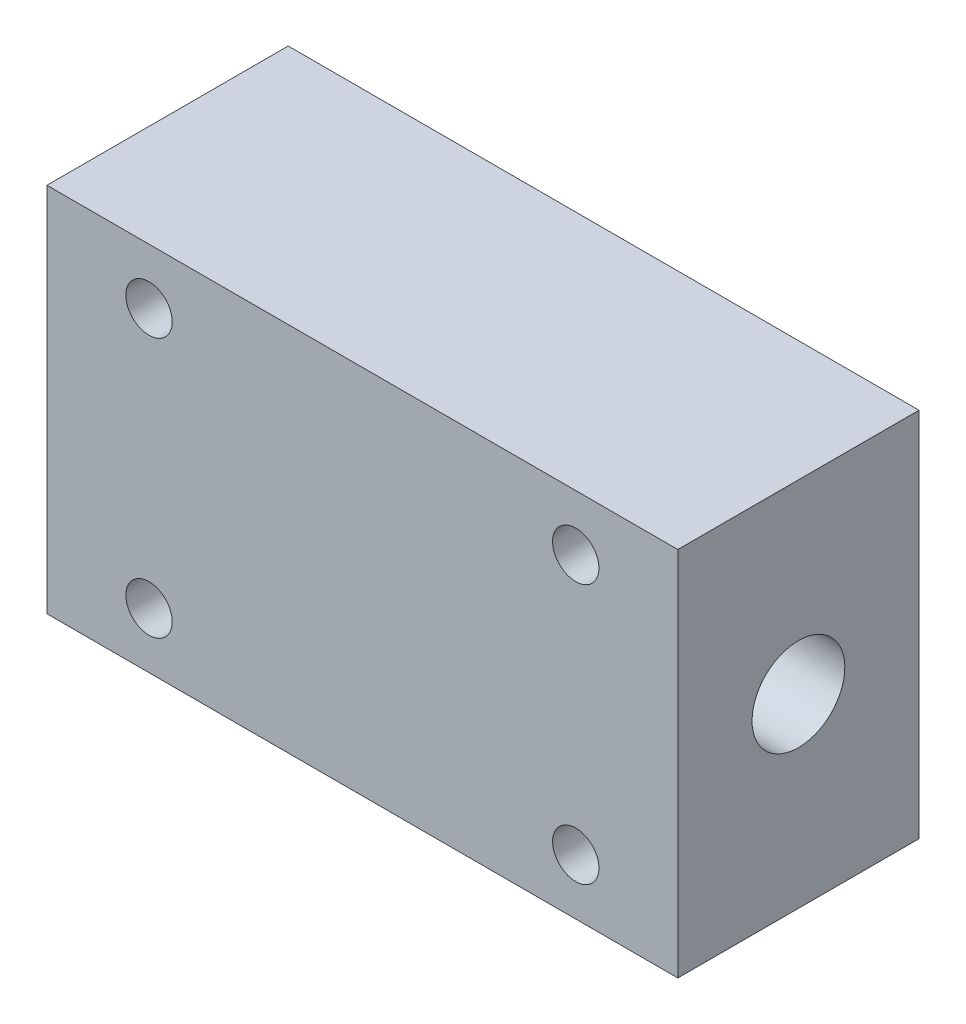
ISO-10303-21;
HEADER;
FILE_DESCRIPTION(('STEP AP214'),'2;1');
FILE_NAME('part.step','',(''),(''),'','','');
FILE_SCHEMA(('AUTOMOTIVE_DESIGN { 1 0 10303 214 1 1 1 1 }'));
ENDSEC;
DATA;
#1=APPLICATION_CONTEXT('core data for automotive mechanical design processes');
#2=APPLICATION_PROTOCOL_DEFINITION('international standard','automotive_design',2000,#1);
#3=PRODUCT_CONTEXT('',#1,'mechanical');
#4=PRODUCT('Part','Part','',(#3));
#5=PRODUCT_RELATED_PRODUCT_CATEGORY('part','',(#4));
#6=PRODUCT_DEFINITION_FORMATION('','',#4);
#7=PRODUCT_DEFINITION_CONTEXT('part definition',#1,'design');
#8=PRODUCT_DEFINITION('design','',#6,#7);
#9=PRODUCT_DEFINITION_SHAPE('','',#8);
#10=(LENGTH_UNIT() NAMED_UNIT(*) SI_UNIT(.MILLI.,.METRE.));
#11=(NAMED_UNIT(*) PLANE_ANGLE_UNIT() SI_UNIT($,.RADIAN.));
#12=(NAMED_UNIT(*) SI_UNIT($,.STERADIAN.) SOLID_ANGLE_UNIT());
#13=UNCERTAINTY_MEASURE_WITH_UNIT(LENGTH_MEASURE(1.E-05),#10,'distance_accuracy_value','');
#14=(GEOMETRIC_REPRESENTATION_CONTEXT(3) GLOBAL_UNCERTAINTY_ASSIGNED_CONTEXT((#13)) GLOBAL_UNIT_ASSIGNED_CONTEXT((#10,
#11,#12)) REPRESENTATION_CONTEXT('',''));
#15=CARTESIAN_POINT('',(0.,0.,0.));
#16=DIRECTION('',(0.,0.,1.));
#17=DIRECTION('',(1.,0.,0.));
#18=AXIS2_PLACEMENT_3D('',#15,#16,#17);
#19=CARTESIAN_POINT('',(0.,0.,-26.));
#20=DIRECTION('',(-1.,0.,0.));
#21=DIRECTION('',(0.,-1.,0.));
#22=AXIS2_PLACEMENT_3D('',#19,#20,#21);
#23=PLANE('',#22);
#24=CARTESIAN_POINT('',(0.,20.,-13.));
#25=DIRECTION('',(-1.,0.,0.));
#26=DIRECTION('',(0.,-1.,0.));
#27=AXIS2_PLACEMENT_3D('',#24,#25,#26);
#28=CIRCLE('',#27,5.);
#29=CARTESIAN_POINT('',(0.,15.,-13.));
#30=VERTEX_POINT('',#29);
#31=EDGE_CURVE('E179',#30,#30,#28,.T.);
#32=ORIENTED_EDGE('',*,*,#31,.F.);
#33=EDGE_LOOP('',(#32));
#34=FACE_BOUND('',#33,.T.);
#35=DIRECTION('',(0.,-1.,0.));
#36=VECTOR('',#35,1.);
#37=CARTESIAN_POINT('',(0.,0.,0.));
#38=LINE('',#37,#36);
#39=CARTESIAN_POINT('',(0.,40.,0.));
#40=VERTEX_POINT('',#39);
#41=CARTESIAN_POINT('',(0.,0.,0.));
#42=VERTEX_POINT('',#41);
#43=EDGE_CURVE('E98',#40,#42,#38,.T.);
#44=ORIENTED_EDGE('',*,*,#43,.F.);
#45=DIRECTION('',(0.,0.,1.));
#46=VECTOR('',#45,1.);
#47=CARTESIAN_POINT('',(0.,40.,-26.));
#48=LINE('',#47,#46);
#49=CARTESIAN_POINT('',(0.,40.,-26.));
#50=VERTEX_POINT('',#49);
#51=EDGE_CURVE('E11',#50,#40,#48,.T.);
#52=ORIENTED_EDGE('',*,*,#51,.F.);
#53=DIRECTION('',(0.,-1.,0.));
#54=VECTOR('',#53,1.);
#55=CARTESIAN_POINT('',(0.,0.,-26.));
#56=LINE('',#55,#54);
#57=CARTESIAN_POINT('',(0.,0.,-26.));
#58=VERTEX_POINT('',#57);
#59=EDGE_CURVE('E91',#50,#58,#56,.T.);
#60=ORIENTED_EDGE('',*,*,#59,.T.);
#61=DIRECTION('',(0.,0.,1.));
#62=VECTOR('',#61,1.);
#63=CARTESIAN_POINT('',(0.,0.,-26.));
#64=LINE('',#63,#62);
#65=EDGE_CURVE('E36',#58,#42,#64,.T.);
#66=ORIENTED_EDGE('',*,*,#65,.T.);
#67=EDGE_LOOP('',(#44,#52,#60,#66));
#68=FACE_BOUND('',#67,.T.);
#69=ADVANCED_FACE('F33',(#34,#68),#23,.T.);
#70=CARTESIAN_POINT('',(0.,40.,-26.));
#71=DIRECTION('',(0.,1.,0.));
#72=DIRECTION('',(0.,0.,1.));
#73=AXIS2_PLACEMENT_3D('',#70,#71,#72);
#74=PLANE('',#73);
#75=DIRECTION('',(-1.,0.,0.));
#76=VECTOR('',#75,1.);
#77=CARTESIAN_POINT('',(0.,40.,0.));
#78=LINE('',#77,#76);
#79=CARTESIAN_POINT('',(68.,40.,0.));
#80=VERTEX_POINT('',#79);
#81=EDGE_CURVE('E93',#80,#40,#78,.T.);
#82=ORIENTED_EDGE('',*,*,#81,.F.);
#83=DIRECTION('',(0.,0.,1.));
#84=VECTOR('',#83,1.);
#85=CARTESIAN_POINT('',(68.,40.,-26.));
#86=LINE('',#85,#84);
#87=CARTESIAN_POINT('',(68.,40.,-26.));
#88=VERTEX_POINT('',#87);
#89=EDGE_CURVE('E42',#88,#80,#86,.T.);
#90=ORIENTED_EDGE('',*,*,#89,.F.);
#91=DIRECTION('',(-1.,0.,0.));
#92=VECTOR('',#91,1.);
#93=CARTESIAN_POINT('',(0.,40.,-26.));
#94=LINE('',#93,#92);
#95=EDGE_CURVE('E88',#88,#50,#94,.T.);
#96=ORIENTED_EDGE('',*,*,#95,.T.);
#97=ORIENTED_EDGE('',*,*,#51,.T.);
#98=EDGE_LOOP('',(#82,#90,#96,#97));
#99=FACE_BOUND('',#98,.T.);
#100=ADVANCED_FACE('F109',(#99),#74,.T.);
#101=CARTESIAN_POINT('',(68.,0.,-26.));
#102=DIRECTION('',(1.,0.,0.));
#103=DIRECTION('',(0.,1.,0.));
#104=AXIS2_PLACEMENT_3D('',#101,#102,#103);
#105=PLANE('',#104);
#106=CARTESIAN_POINT('',(68.,20.,-13.));
#107=DIRECTION('',(-1.,0.,0.));
#108=DIRECTION('',(0.,-1.,0.));
#109=AXIS2_PLACEMENT_3D('',#106,#107,#108);
#110=CIRCLE('',#109,5.);
#111=CARTESIAN_POINT('',(68.,15.,-13.));
#112=VERTEX_POINT('',#111);
#113=EDGE_CURVE('E102',#112,#112,#110,.T.);
#114=ORIENTED_EDGE('',*,*,#113,.T.);
#115=EDGE_LOOP('',(#114));
#116=FACE_BOUND('',#115,.T.);
#117=DIRECTION('',(0.,1.,0.));
#118=VECTOR('',#117,1.);
#119=CARTESIAN_POINT('',(68.,0.,0.));
#120=LINE('',#119,#118);
#121=CARTESIAN_POINT('',(68.,0.,0.));
#122=VERTEX_POINT('',#121);
#123=EDGE_CURVE('E83',#122,#80,#120,.T.);
#124=ORIENTED_EDGE('',*,*,#123,.F.);
#125=DIRECTION('',(0.,0.,1.));
#126=VECTOR('',#125,1.);
#127=CARTESIAN_POINT('',(68.,0.,-26.));
#128=LINE('',#127,#126);
#129=CARTESIAN_POINT('',(68.,0.,-26.));
#130=VERTEX_POINT('',#129);
#131=EDGE_CURVE('E78',#130,#122,#128,.T.);
#132=ORIENTED_EDGE('',*,*,#131,.F.);
#133=DIRECTION('',(0.,1.,0.));
#134=VECTOR('',#133,1.);
#135=CARTESIAN_POINT('',(68.,0.,-26.));
#136=LINE('',#135,#134);
#137=EDGE_CURVE('E81',#130,#88,#136,.T.);
#138=ORIENTED_EDGE('',*,*,#137,.T.);
#139=ORIENTED_EDGE('',*,*,#89,.T.);
#140=EDGE_LOOP('',(#124,#132,#138,#139));
#141=FACE_BOUND('',#140,.T.);
#142=ADVANCED_FACE('F80',(#116,#141),#105,.T.);
#143=CARTESIAN_POINT('',(0.,0.,-26.));
#144=DIRECTION('',(0.,-1.,0.));
#145=DIRECTION('',(0.,0.,-1.));
#146=AXIS2_PLACEMENT_3D('',#143,#144,#145);
#147=PLANE('',#146);
#148=DIRECTION('',(1.,0.,0.));
#149=VECTOR('',#148,1.);
#150=CARTESIAN_POINT('',(0.,0.,0.));
#151=LINE('',#150,#149);
#152=EDGE_CURVE('E101',#42,#122,#151,.T.);
#153=ORIENTED_EDGE('',*,*,#152,.F.);
#154=ORIENTED_EDGE('',*,*,#65,.F.);
#155=DIRECTION('',(1.,0.,0.));
#156=VECTOR('',#155,1.);
#157=CARTESIAN_POINT('',(0.,0.,-26.));
#158=LINE('',#157,#156);
#159=EDGE_CURVE('E87',#58,#130,#158,.T.);
#160=ORIENTED_EDGE('',*,*,#159,.T.);
#161=ORIENTED_EDGE('',*,*,#131,.T.);
#162=EDGE_LOOP('',(#153,#154,#160,#161));
#163=FACE_BOUND('',#162,.T.);
#164=ADVANCED_FACE('F90',(#163),#147,.T.);
#165=CARTESIAN_POINT('',(0.,0.,-26.));
#166=DIRECTION('',(0.,0.,-1.));
#167=DIRECTION('',(-1.,0.,0.));
#168=AXIS2_PLACEMENT_3D('',#165,#166,#167);
#169=PLANE('',#168);
#170=CARTESIAN_POINT('',(11.,6.,-26.));
#171=DIRECTION('',(0.,0.,-1.));
#172=DIRECTION('',(1.,0.,0.));
#173=AXIS2_PLACEMENT_3D('',#170,#171,#172);
#174=CIRCLE('',#173,2.5);
#175=CARTESIAN_POINT('',(8.50000000000001,6.,-26.));
#176=VERTEX_POINT('',#175);
#177=EDGE_CURVE('E159',#176,#176,#174,.T.);
#178=ORIENTED_EDGE('',*,*,#177,.F.);
#179=EDGE_LOOP('',(#178));
#180=FACE_BOUND('',#179,.T.);
#181=CARTESIAN_POINT('',(57.,5.99999999999998,-26.));
#182=DIRECTION('',(0.,0.,-1.));
#183=DIRECTION('',(-1.,0.,0.));
#184=AXIS2_PLACEMENT_3D('',#181,#182,#183);
#185=CIRCLE('',#184,2.5);
#186=CARTESIAN_POINT('',(54.5,5.99999999999998,-26.));
#187=VERTEX_POINT('',#186);
#188=EDGE_CURVE('E161',#187,#187,#185,.T.);
#189=ORIENTED_EDGE('',*,*,#188,.F.);
#190=EDGE_LOOP('',(#189));
#191=FACE_BOUND('',#190,.T.);
#192=CARTESIAN_POINT('',(57.,34.,-26.));
#193=DIRECTION('',(0.,0.,-1.));
#194=DIRECTION('',(1.,0.,0.));
#195=AXIS2_PLACEMENT_3D('',#192,#193,#194);
#196=CIRCLE('',#195,2.5);
#197=CARTESIAN_POINT('',(54.5,34.,-26.));
#198=VERTEX_POINT('',#197);
#199=EDGE_CURVE('E167',#198,#198,#196,.T.);
#200=ORIENTED_EDGE('',*,*,#199,.F.);
#201=EDGE_LOOP('',(#200));
#202=FACE_BOUND('',#201,.T.);
#203=CARTESIAN_POINT('',(11.,34.,-26.));
#204=DIRECTION('',(0.,0.,-1.));
#205=DIRECTION('',(-1.,0.,0.));
#206=AXIS2_PLACEMENT_3D('',#203,#204,#205);
#207=CIRCLE('',#206,2.5);
#208=CARTESIAN_POINT('',(8.50000000000001,34.,-26.));
#209=VERTEX_POINT('',#208);
#210=EDGE_CURVE('E173',#209,#209,#207,.T.);
#211=ORIENTED_EDGE('',*,*,#210,.F.);
#212=EDGE_LOOP('',(#211));
#213=FACE_BOUND('',#212,.T.);
#214=ORIENTED_EDGE('',*,*,#59,.F.);
#215=ORIENTED_EDGE('',*,*,#95,.F.);
#216=ORIENTED_EDGE('',*,*,#137,.F.);
#217=ORIENTED_EDGE('',*,*,#159,.F.);
#218=EDGE_LOOP('',(#214,#215,#216,#217));
#219=FACE_BOUND('',#218,.T.);
#220=ADVANCED_FACE('F86',(#180,#191,#202,#213,#219),#169,.T.);
#221=CARTESIAN_POINT('',(0.,0.,0.));
#222=DIRECTION('',(0.,0.,-1.));
#223=DIRECTION('',(-1.,0.,0.));
#224=AXIS2_PLACEMENT_3D('',#221,#222,#223);
#225=PLANE('',#224);
#226=CARTESIAN_POINT('',(11.,6.,0.));
#227=DIRECTION('',(0.,0.,-1.));
#228=DIRECTION('',(1.,0.,0.));
#229=AXIS2_PLACEMENT_3D('',#226,#227,#228);
#230=CIRCLE('',#229,2.5);
#231=CARTESIAN_POINT('',(8.50000000000001,6.,0.));
#232=VERTEX_POINT('',#231);
#233=EDGE_CURVE('E157',#232,#232,#230,.T.);
#234=ORIENTED_EDGE('',*,*,#233,.T.);
#235=EDGE_LOOP('',(#234));
#236=FACE_BOUND('',#235,.T.);
#237=CARTESIAN_POINT('',(57.,5.99999999999998,0.));
#238=DIRECTION('',(0.,0.,-1.));
#239=DIRECTION('',(-1.,0.,0.));
#240=AXIS2_PLACEMENT_3D('',#237,#238,#239);
#241=CIRCLE('',#240,2.5);
#242=CARTESIAN_POINT('',(54.5,5.99999999999998,0.));
#243=VERTEX_POINT('',#242);
#244=EDGE_CURVE('E164',#243,#243,#241,.T.);
#245=ORIENTED_EDGE('',*,*,#244,.T.);
#246=EDGE_LOOP('',(#245));
#247=FACE_BOUND('',#246,.T.);
#248=CARTESIAN_POINT('',(57.,34.,0.));
#249=DIRECTION('',(0.,0.,-1.));
#250=DIRECTION('',(1.,0.,0.));
#251=AXIS2_PLACEMENT_3D('',#248,#249,#250);
#252=CIRCLE('',#251,2.5);
#253=CARTESIAN_POINT('',(54.5,34.,0.));
#254=VERTEX_POINT('',#253);
#255=EDGE_CURVE('E170',#254,#254,#252,.T.);
#256=ORIENTED_EDGE('',*,*,#255,.T.);
#257=EDGE_LOOP('',(#256));
#258=FACE_BOUND('',#257,.T.);
#259=CARTESIAN_POINT('',(11.,34.,0.));
#260=DIRECTION('',(0.,0.,-1.));
#261=DIRECTION('',(-1.,0.,0.));
#262=AXIS2_PLACEMENT_3D('',#259,#260,#261);
#263=CIRCLE('',#262,2.5);
#264=CARTESIAN_POINT('',(8.50000000000001,34.,0.));
#265=VERTEX_POINT('',#264);
#266=EDGE_CURVE('E176',#265,#265,#263,.T.);
#267=ORIENTED_EDGE('',*,*,#266,.T.);
#268=EDGE_LOOP('',(#267));
#269=FACE_BOUND('',#268,.T.);
#270=ORIENTED_EDGE('',*,*,#43,.T.);
#271=ORIENTED_EDGE('',*,*,#152,.T.);
#272=ORIENTED_EDGE('',*,*,#123,.T.);
#273=ORIENTED_EDGE('',*,*,#81,.T.);
#274=EDGE_LOOP('',(#270,#271,#272,#273));
#275=FACE_BOUND('',#274,.T.);
#276=ADVANCED_FACE('F108',(#236,#247,#258,#269,#275),#225,.F.);
#277=CARTESIAN_POINT('',(68.,20.,-13.));
#278=DIRECTION('',(-1.,0.,0.));
#279=DIRECTION('',(0.,-1.,0.));
#280=AXIS2_PLACEMENT_3D('',#277,#278,#279);
#281=CYLINDRICAL_SURFACE('',#280,5.);
#282=ORIENTED_EDGE('',*,*,#113,.F.);
#283=EDGE_LOOP('',(#282));
#284=FACE_BOUND('',#283,.T.);
#285=ORIENTED_EDGE('',*,*,#31,.T.);
#286=EDGE_LOOP('',(#285));
#287=FACE_BOUND('',#286,.T.);
#288=ADVANCED_FACE('F129',(#284,#287),#281,.F.);
#289=CARTESIAN_POINT('',(11.,34.,0.));
#290=DIRECTION('',(0.,0.,-1.));
#291=DIRECTION('',(-1.,0.,0.));
#292=AXIS2_PLACEMENT_3D('',#289,#290,#291);
#293=CYLINDRICAL_SURFACE('',#292,2.5);
#294=CARTESIAN_POINT('',(8.50000000000001,34.,0.));
#295=CARTESIAN_POINT('',(8.50000000000001,34.,-0.270833333333333));
#296=CARTESIAN_POINT('',(8.50000000000001,34.,-0.541666666666667));
#297=CARTESIAN_POINT('',(8.50000000000001,34.,-1.08333333333333));
#298=CARTESIAN_POINT('',(8.50000000000001,34.,-1.35416666666667));
#299=CARTESIAN_POINT('',(8.50000000000001,34.,-1.89583333333333));
#300=CARTESIAN_POINT('',(8.50000000000001,34.,-2.16666666666667));
#301=CARTESIAN_POINT('',(8.50000000000001,34.,-2.70833333333333));
#302=CARTESIAN_POINT('',(8.50000000000001,34.,-2.97916666666667));
#303=CARTESIAN_POINT('',(8.50000000000001,34.,-3.52083333333333));
#304=CARTESIAN_POINT('',(8.50000000000001,34.,-3.79166666666667));
#305=CARTESIAN_POINT('',(8.50000000000001,34.,-4.33333333333333));
#306=CARTESIAN_POINT('',(8.50000000000001,34.,-4.60416666666667));
#307=CARTESIAN_POINT('',(8.50000000000001,34.,-5.14583333333333));
#308=CARTESIAN_POINT('',(8.50000000000001,34.,-5.41666666666667));
#309=CARTESIAN_POINT('',(8.50000000000001,34.,-5.95833333333333));
#310=CARTESIAN_POINT('',(8.50000000000001,34.,-6.22916666666667));
#311=CARTESIAN_POINT('',(8.50000000000001,34.,-6.77083333333333));
#312=CARTESIAN_POINT('',(8.50000000000001,34.,-7.04166666666667));
#313=CARTESIAN_POINT('',(8.50000000000001,34.,-7.58333333333333));
#314=CARTESIAN_POINT('',(8.50000000000001,34.,-7.85416666666667));
#315=CARTESIAN_POINT('',(8.50000000000001,34.,-8.39583333333333));
#316=CARTESIAN_POINT('',(8.50000000000001,34.,-8.66666666666667));
#317=CARTESIAN_POINT('',(8.50000000000001,34.,-9.20833333333333));
#318=CARTESIAN_POINT('',(8.50000000000001,34.,-9.47916666666667));
#319=CARTESIAN_POINT('',(8.50000000000001,34.,-10.0208333333333));
#320=CARTESIAN_POINT('',(8.50000000000001,34.,-10.2916666666667));
#321=CARTESIAN_POINT('',(8.50000000000001,34.,-10.8333333333333));
#322=CARTESIAN_POINT('',(8.50000000000001,34.,-11.1041666666667));
#323=CARTESIAN_POINT('',(8.50000000000001,34.,-11.6458333333333));
#324=CARTESIAN_POINT('',(8.50000000000001,34.,-11.9166666666667));
#325=CARTESIAN_POINT('',(8.50000000000001,34.,-12.4583333333333));
#326=CARTESIAN_POINT('',(8.50000000000001,34.,-12.7291666666667));
#327=CARTESIAN_POINT('',(8.50000000000001,34.,-13.2708333333333));
#328=CARTESIAN_POINT('',(8.50000000000001,34.,-13.5416666666667));
#329=CARTESIAN_POINT('',(8.50000000000001,34.,-14.0833333333333));
#330=CARTESIAN_POINT('',(8.50000000000001,34.,-14.3541666666667));
#331=CARTESIAN_POINT('',(8.50000000000001,34.,-14.8958333333333));
#332=CARTESIAN_POINT('',(8.50000000000001,34.,-15.1666666666667));
#333=CARTESIAN_POINT('',(8.50000000000001,34.,-15.7083333333333));
#334=CARTESIAN_POINT('',(8.50000000000001,34.,-15.9791666666667));
#335=CARTESIAN_POINT('',(8.50000000000001,34.,-16.5208333333333));
#336=CARTESIAN_POINT('',(8.50000000000001,34.,-16.7916666666667));
#337=CARTESIAN_POINT('',(8.50000000000001,34.,-17.3333333333333));
#338=CARTESIAN_POINT('',(8.50000000000001,34.,-17.6041666666667));
#339=CARTESIAN_POINT('',(8.50000000000001,34.,-18.1458333333333));
#340=CARTESIAN_POINT('',(8.50000000000001,34.,-18.4166666666667));
#341=CARTESIAN_POINT('',(8.50000000000001,34.,-18.9583333333333));
#342=CARTESIAN_POINT('',(8.50000000000001,34.,-19.2291666666667));
#343=CARTESIAN_POINT('',(8.50000000000001,34.,-19.7708333333333));
#344=CARTESIAN_POINT('',(8.50000000000001,34.,-20.0416666666667));
#345=CARTESIAN_POINT('',(8.50000000000001,34.,-20.5833333333333));
#346=CARTESIAN_POINT('',(8.50000000000001,34.,-20.8541666666667));
#347=CARTESIAN_POINT('',(8.50000000000001,34.,-21.3958333333333));
#348=CARTESIAN_POINT('',(8.50000000000001,34.,-21.6666666666667));
#349=CARTESIAN_POINT('',(8.50000000000001,34.,-22.2083333333333));
#350=CARTESIAN_POINT('',(8.50000000000001,34.,-22.4791666666667));
#351=CARTESIAN_POINT('',(8.50000000000001,34.,-23.0208333333333));
#352=CARTESIAN_POINT('',(8.50000000000001,34.,-23.2916666666667));
#353=CARTESIAN_POINT('',(8.50000000000001,34.,-23.8333333333333));
#354=CARTESIAN_POINT('',(8.50000000000001,34.,-24.1041666666667));
#355=CARTESIAN_POINT('',(8.50000000000001,34.,-24.6458333333333));
#356=CARTESIAN_POINT('',(8.50000000000001,34.,-24.9166666666667));
#357=CARTESIAN_POINT('',(8.50000000000001,34.,-25.4583333333333));
#358=CARTESIAN_POINT('',(8.50000000000001,34.,-25.7291666666667));
#359=CARTESIAN_POINT('',(8.50000000000001,34.,-26.));
#360=B_SPLINE_CURVE_WITH_KNOTS('',3,(#294,#295,#296,#297,#298,#299,#300,#301,#302,#303,#304,
#305,#306,#307,#308,#309,#310,#311,#312,#313,#314,#315,#316,#317,#318,#319,#320,#321,#322,#323,
#324,#325,#326,#327,#328,#329,#330,#331,#332,#333,#334,#335,#336,#337,#338,#339,#340,#341,#342,
#343,#344,#345,#346,#347,#348,#349,#350,#351,#352,#353,#354,#355,#356,#357,#358,#359),
.UNSPECIFIED.,.F.,.F.,(4,2,2,2,2,2,2,2,2,2,2,2,2,2,2,2,2,2,2,2,2,2,2,2,2,2,2,2,2,2,2,2,4),(0.,
0.8125,1.625,2.4375,3.25,4.0625,4.875,5.6875,6.5,7.3125,8.125,8.9375,9.75,10.5625,11.375,
12.1875,13.,13.8125,14.625,15.4375,16.25,17.0625,17.875,18.6875,19.5,20.3125,21.125,21.9375,
22.75,23.5625,24.375,25.1875,26.),.UNSPECIFIED.);
#361=EDGE_CURVE('BSEAM136',#265,#209,#360,.T.);
#362=ORIENTED_EDGE('',*,*,#266,.F.);
#363=ORIENTED_EDGE('',*,*,#210,.T.);
#364=ORIENTED_EDGE('',*,*,#361,.T.);
#365=ORIENTED_EDGE('',*,*,#361,.F.);
#366=EDGE_LOOP('',(#362,#364,#363,#365));
#367=FACE_BOUND('',#366,.T.);
#368=ADVANCED_FACE('F136',(#367),#293,.F.);
#369=CARTESIAN_POINT('',(57.,34.,0.));
#370=DIRECTION('',(0.,0.,-1.));
#371=DIRECTION('',(-1.,0.,0.));
#372=AXIS2_PLACEMENT_3D('',#369,#370,#371);
#373=CYLINDRICAL_SURFACE('',#372,2.5);
#374=CARTESIAN_POINT('',(54.5,34.,0.));
#375=CARTESIAN_POINT('',(54.5,34.,-0.270833333333333));
#376=CARTESIAN_POINT('',(54.5,34.,-0.541666666666667));
#377=CARTESIAN_POINT('',(54.5,34.,-1.08333333333333));
#378=CARTESIAN_POINT('',(54.5,34.,-1.35416666666667));
#379=CARTESIAN_POINT('',(54.5,34.,-1.89583333333333));
#380=CARTESIAN_POINT('',(54.5,34.,-2.16666666666667));
#381=CARTESIAN_POINT('',(54.5,34.,-2.70833333333333));
#382=CARTESIAN_POINT('',(54.5,34.,-2.97916666666667));
#383=CARTESIAN_POINT('',(54.5,34.,-3.52083333333333));
#384=CARTESIAN_POINT('',(54.5,34.,-3.79166666666667));
#385=CARTESIAN_POINT('',(54.5,34.,-4.33333333333333));
#386=CARTESIAN_POINT('',(54.5,34.,-4.60416666666667));
#387=CARTESIAN_POINT('',(54.5,34.,-5.14583333333333));
#388=CARTESIAN_POINT('',(54.5,34.,-5.41666666666667));
#389=CARTESIAN_POINT('',(54.5,34.,-5.95833333333333));
#390=CARTESIAN_POINT('',(54.5,34.,-6.22916666666667));
#391=CARTESIAN_POINT('',(54.5,34.,-6.77083333333333));
#392=CARTESIAN_POINT('',(54.5,34.,-7.04166666666667));
#393=CARTESIAN_POINT('',(54.5,34.,-7.58333333333333));
#394=CARTESIAN_POINT('',(54.5,34.,-7.85416666666667));
#395=CARTESIAN_POINT('',(54.5,34.,-8.39583333333333));
#396=CARTESIAN_POINT('',(54.5,34.,-8.66666666666667));
#397=CARTESIAN_POINT('',(54.5,34.,-9.20833333333333));
#398=CARTESIAN_POINT('',(54.5,34.,-9.47916666666667));
#399=CARTESIAN_POINT('',(54.5,34.,-10.0208333333333));
#400=CARTESIAN_POINT('',(54.5,34.,-10.2916666666667));
#401=CARTESIAN_POINT('',(54.5,34.,-10.8333333333333));
#402=CARTESIAN_POINT('',(54.5,34.,-11.1041666666667));
#403=CARTESIAN_POINT('',(54.5,34.,-11.6458333333333));
#404=CARTESIAN_POINT('',(54.5,34.,-11.9166666666667));
#405=CARTESIAN_POINT('',(54.5,34.,-12.4583333333333));
#406=CARTESIAN_POINT('',(54.5,34.,-12.7291666666667));
#407=CARTESIAN_POINT('',(54.5,34.,-13.2708333333333));
#408=CARTESIAN_POINT('',(54.5,34.,-13.5416666666667));
#409=CARTESIAN_POINT('',(54.5,34.,-14.0833333333333));
#410=CARTESIAN_POINT('',(54.5,34.,-14.3541666666667));
#411=CARTESIAN_POINT('',(54.5,34.,-14.8958333333333));
#412=CARTESIAN_POINT('',(54.5,34.,-15.1666666666667));
#413=CARTESIAN_POINT('',(54.5,34.,-15.7083333333333));
#414=CARTESIAN_POINT('',(54.5,34.,-15.9791666666667));
#415=CARTESIAN_POINT('',(54.5,34.,-16.5208333333333));
#416=CARTESIAN_POINT('',(54.5,34.,-16.7916666666667));
#417=CARTESIAN_POINT('',(54.5,34.,-17.3333333333333));
#418=CARTESIAN_POINT('',(54.5,34.,-17.6041666666667));
#419=CARTESIAN_POINT('',(54.5,34.,-18.1458333333333));
#420=CARTESIAN_POINT('',(54.5,34.,-18.4166666666667));
#421=CARTESIAN_POINT('',(54.5,34.,-18.9583333333333));
#422=CARTESIAN_POINT('',(54.5,34.,-19.2291666666667));
#423=CARTESIAN_POINT('',(54.5,34.,-19.7708333333333));
#424=CARTESIAN_POINT('',(54.5,34.,-20.0416666666667));
#425=CARTESIAN_POINT('',(54.5,34.,-20.5833333333333));
#426=CARTESIAN_POINT('',(54.5,34.,-20.8541666666667));
#427=CARTESIAN_POINT('',(54.5,34.,-21.3958333333333));
#428=CARTESIAN_POINT('',(54.5,34.,-21.6666666666667));
#429=CARTESIAN_POINT('',(54.5,34.,-22.2083333333333));
#430=CARTESIAN_POINT('',(54.5,34.,-22.4791666666667));
#431=CARTESIAN_POINT('',(54.5,34.,-23.0208333333333));
#432=CARTESIAN_POINT('',(54.5,34.,-23.2916666666667));
#433=CARTESIAN_POINT('',(54.5,34.,-23.8333333333333));
#434=CARTESIAN_POINT('',(54.5,34.,-24.1041666666667));
#435=CARTESIAN_POINT('',(54.5,34.,-24.6458333333333));
#436=CARTESIAN_POINT('',(54.5,34.,-24.9166666666667));
#437=CARTESIAN_POINT('',(54.5,34.,-25.4583333333333));
#438=CARTESIAN_POINT('',(54.5,34.,-25.7291666666667));
#439=CARTESIAN_POINT('',(54.5,34.,-26.));
#440=B_SPLINE_CURVE_WITH_KNOTS('',3,(#374,#375,#376,#377,#378,#379,#380,#381,#382,#383,#384,
#385,#386,#387,#388,#389,#390,#391,#392,#393,#394,#395,#396,#397,#398,#399,#400,#401,#402,#403,
#404,#405,#406,#407,#408,#409,#410,#411,#412,#413,#414,#415,#416,#417,#418,#419,#420,#421,#422,
#423,#424,#425,#426,#427,#428,#429,#430,#431,#432,#433,#434,#435,#436,#437,#438,#439),
.UNSPECIFIED.,.F.,.F.,(4,2,2,2,2,2,2,2,2,2,2,2,2,2,2,2,2,2,2,2,2,2,2,2,2,2,2,2,2,2,2,2,4),(0.,
0.8125,1.625,2.4375,3.25,4.0625,4.875,5.6875,6.5,7.3125,8.125,8.9375,9.75,10.5625,11.375,
12.1875,13.,13.8125,14.625,15.4375,16.25,17.0625,17.875,18.6875,19.5,20.3125,21.125,21.9375,
22.75,23.5625,24.375,25.1875,26.),.UNSPECIFIED.);
#441=EDGE_CURVE('BSEAM140',#254,#198,#440,.T.);
#442=ORIENTED_EDGE('',*,*,#255,.F.);
#443=ORIENTED_EDGE('',*,*,#199,.T.);
#444=ORIENTED_EDGE('',*,*,#441,.T.);
#445=ORIENTED_EDGE('',*,*,#441,.F.);
#446=EDGE_LOOP('',(#442,#444,#443,#445));
#447=FACE_BOUND('',#446,.T.);
#448=ADVANCED_FACE('F140',(#447),#373,.F.);
#449=CARTESIAN_POINT('',(57.,5.99999999999998,0.));
#450=DIRECTION('',(0.,0.,-1.));
#451=DIRECTION('',(-1.,0.,0.));
#452=AXIS2_PLACEMENT_3D('',#449,#450,#451);
#453=CYLINDRICAL_SURFACE('',#452,2.5);
#454=CARTESIAN_POINT('',(54.5,5.99999999999998,0.));
#455=CARTESIAN_POINT('',(54.5,5.99999999999998,-0.270833333333333));
#456=CARTESIAN_POINT('',(54.5,5.99999999999998,-0.541666666666667));
#457=CARTESIAN_POINT('',(54.5,5.99999999999998,-1.08333333333333));
#458=CARTESIAN_POINT('',(54.5,5.99999999999998,-1.35416666666667));
#459=CARTESIAN_POINT('',(54.5,5.99999999999998,-1.89583333333333));
#460=CARTESIAN_POINT('',(54.5,5.99999999999998,-2.16666666666667));
#461=CARTESIAN_POINT('',(54.5,5.99999999999998,-2.70833333333333));
#462=CARTESIAN_POINT('',(54.5,5.99999999999998,-2.97916666666667));
#463=CARTESIAN_POINT('',(54.5,5.99999999999998,-3.52083333333333));
#464=CARTESIAN_POINT('',(54.5,5.99999999999998,-3.79166666666667));
#465=CARTESIAN_POINT('',(54.5,5.99999999999998,-4.33333333333333));
#466=CARTESIAN_POINT('',(54.5,5.99999999999998,-4.60416666666667));
#467=CARTESIAN_POINT('',(54.5,5.99999999999998,-5.14583333333333));
#468=CARTESIAN_POINT('',(54.5,5.99999999999998,-5.41666666666667));
#469=CARTESIAN_POINT('',(54.5,5.99999999999998,-5.95833333333333));
#470=CARTESIAN_POINT('',(54.5,5.99999999999998,-6.22916666666667));
#471=CARTESIAN_POINT('',(54.5,5.99999999999998,-6.77083333333333));
#472=CARTESIAN_POINT('',(54.5,5.99999999999998,-7.04166666666667));
#473=CARTESIAN_POINT('',(54.5,5.99999999999998,-7.58333333333333));
#474=CARTESIAN_POINT('',(54.5,5.99999999999998,-7.85416666666667));
#475=CARTESIAN_POINT('',(54.5,5.99999999999998,-8.39583333333333));
#476=CARTESIAN_POINT('',(54.5,5.99999999999998,-8.66666666666667));
#477=CARTESIAN_POINT('',(54.5,5.99999999999998,-9.20833333333333));
#478=CARTESIAN_POINT('',(54.5,5.99999999999998,-9.47916666666667));
#479=CARTESIAN_POINT('',(54.5,5.99999999999998,-10.0208333333333));
#480=CARTESIAN_POINT('',(54.5,5.99999999999998,-10.2916666666667));
#481=CARTESIAN_POINT('',(54.5,5.99999999999998,-10.8333333333333));
#482=CARTESIAN_POINT('',(54.5,5.99999999999998,-11.1041666666667));
#483=CARTESIAN_POINT('',(54.5,5.99999999999998,-11.6458333333333));
#484=CARTESIAN_POINT('',(54.5,5.99999999999998,-11.9166666666667));
#485=CARTESIAN_POINT('',(54.5,5.99999999999998,-12.4583333333333));
#486=CARTESIAN_POINT('',(54.5,5.99999999999998,-12.7291666666667));
#487=CARTESIAN_POINT('',(54.5,5.99999999999998,-13.2708333333333));
#488=CARTESIAN_POINT('',(54.5,5.99999999999998,-13.5416666666667));
#489=CARTESIAN_POINT('',(54.5,5.99999999999998,-14.0833333333333));
#490=CARTESIAN_POINT('',(54.5,5.99999999999998,-14.3541666666667));
#491=CARTESIAN_POINT('',(54.5,5.99999999999998,-14.8958333333333));
#492=CARTESIAN_POINT('',(54.5,5.99999999999998,-15.1666666666667));
#493=CARTESIAN_POINT('',(54.5,5.99999999999998,-15.7083333333333));
#494=CARTESIAN_POINT('',(54.5,5.99999999999998,-15.9791666666667));
#495=CARTESIAN_POINT('',(54.5,5.99999999999998,-16.5208333333333));
#496=CARTESIAN_POINT('',(54.5,5.99999999999998,-16.7916666666667));
#497=CARTESIAN_POINT('',(54.5,5.99999999999998,-17.3333333333333));
#498=CARTESIAN_POINT('',(54.5,5.99999999999998,-17.6041666666667));
#499=CARTESIAN_POINT('',(54.5,5.99999999999998,-18.1458333333333));
#500=CARTESIAN_POINT('',(54.5,5.99999999999998,-18.4166666666667));
#501=CARTESIAN_POINT('',(54.5,5.99999999999998,-18.9583333333333));
#502=CARTESIAN_POINT('',(54.5,5.99999999999998,-19.2291666666667));
#503=CARTESIAN_POINT('',(54.5,5.99999999999998,-19.7708333333333));
#504=CARTESIAN_POINT('',(54.5,5.99999999999998,-20.0416666666667));
#505=CARTESIAN_POINT('',(54.5,5.99999999999998,-20.5833333333333));
#506=CARTESIAN_POINT('',(54.5,5.99999999999998,-20.8541666666667));
#507=CARTESIAN_POINT('',(54.5,5.99999999999998,-21.3958333333333));
#508=CARTESIAN_POINT('',(54.5,5.99999999999998,-21.6666666666667));
#509=CARTESIAN_POINT('',(54.5,5.99999999999998,-22.2083333333333));
#510=CARTESIAN_POINT('',(54.5,5.99999999999998,-22.4791666666667));
#511=CARTESIAN_POINT('',(54.5,5.99999999999998,-23.0208333333333));
#512=CARTESIAN_POINT('',(54.5,5.99999999999998,-23.2916666666667));
#513=CARTESIAN_POINT('',(54.5,5.99999999999998,-23.8333333333333));
#514=CARTESIAN_POINT('',(54.5,5.99999999999998,-24.1041666666667));
#515=CARTESIAN_POINT('',(54.5,5.99999999999998,-24.6458333333333));
#516=CARTESIAN_POINT('',(54.5,5.99999999999998,-24.9166666666667));
#517=CARTESIAN_POINT('',(54.5,5.99999999999998,-25.4583333333333));
#518=CARTESIAN_POINT('',(54.5,5.99999999999998,-25.7291666666667));
#519=CARTESIAN_POINT('',(54.5,5.99999999999998,-26.));
#520=B_SPLINE_CURVE_WITH_KNOTS('',3,(#454,#455,#456,#457,#458,#459,#460,#461,#462,#463,#464,
#465,#466,#467,#468,#469,#470,#471,#472,#473,#474,#475,#476,#477,#478,#479,#480,#481,#482,#483,
#484,#485,#486,#487,#488,#489,#490,#491,#492,#493,#494,#495,#496,#497,#498,#499,#500,#501,#502,
#503,#504,#505,#506,#507,#508,#509,#510,#511,#512,#513,#514,#515,#516,#517,#518,#519),
.UNSPECIFIED.,.F.,.F.,(4,2,2,2,2,2,2,2,2,2,2,2,2,2,2,2,2,2,2,2,2,2,2,2,2,2,2,2,2,2,2,2,4),(0.,
0.8125,1.625,2.4375,3.25,4.0625,4.875,5.6875,6.5,7.3125,8.125,8.9375,9.75,10.5625,11.375,
12.1875,13.,13.8125,14.625,15.4375,16.25,17.0625,17.875,18.6875,19.5,20.3125,21.125,21.9375,
22.75,23.5625,24.375,25.1875,26.),.UNSPECIFIED.);
#521=EDGE_CURVE('BSEAM144',#243,#187,#520,.T.);
#522=ORIENTED_EDGE('',*,*,#244,.F.);
#523=ORIENTED_EDGE('',*,*,#188,.T.);
#524=ORIENTED_EDGE('',*,*,#521,.T.);
#525=ORIENTED_EDGE('',*,*,#521,.F.);
#526=EDGE_LOOP('',(#522,#524,#523,#525));
#527=FACE_BOUND('',#526,.T.);
#528=ADVANCED_FACE('F144',(#527),#453,.F.);
#529=CARTESIAN_POINT('',(11.,6.,0.));
#530=DIRECTION('',(0.,0.,-1.));
#531=DIRECTION('',(-1.,0.,0.));
#532=AXIS2_PLACEMENT_3D('',#529,#530,#531);
#533=CYLINDRICAL_SURFACE('',#532,2.5);
#534=CARTESIAN_POINT('',(8.50000000000001,6.,0.));
#535=CARTESIAN_POINT('',(8.50000000000001,6.,-0.270833333333333));
#536=CARTESIAN_POINT('',(8.50000000000001,6.,-0.541666666666667));
#537=CARTESIAN_POINT('',(8.50000000000001,6.,-1.08333333333333));
#538=CARTESIAN_POINT('',(8.50000000000001,6.,-1.35416666666667));
#539=CARTESIAN_POINT('',(8.50000000000001,6.,-1.89583333333333));
#540=CARTESIAN_POINT('',(8.50000000000001,6.,-2.16666666666667));
#541=CARTESIAN_POINT('',(8.50000000000001,6.,-2.70833333333333));
#542=CARTESIAN_POINT('',(8.50000000000001,6.,-2.97916666666667));
#543=CARTESIAN_POINT('',(8.50000000000001,6.,-3.52083333333333));
#544=CARTESIAN_POINT('',(8.50000000000001,6.,-3.79166666666667));
#545=CARTESIAN_POINT('',(8.50000000000001,6.,-4.33333333333333));
#546=CARTESIAN_POINT('',(8.50000000000001,6.,-4.60416666666667));
#547=CARTESIAN_POINT('',(8.50000000000001,6.,-5.14583333333333));
#548=CARTESIAN_POINT('',(8.50000000000001,6.,-5.41666666666667));
#549=CARTESIAN_POINT('',(8.50000000000001,6.,-5.95833333333333));
#550=CARTESIAN_POINT('',(8.50000000000001,6.,-6.22916666666667));
#551=CARTESIAN_POINT('',(8.50000000000001,6.,-6.77083333333333));
#552=CARTESIAN_POINT('',(8.50000000000001,6.,-7.04166666666667));
#553=CARTESIAN_POINT('',(8.50000000000001,6.,-7.58333333333333));
#554=CARTESIAN_POINT('',(8.50000000000001,6.,-7.85416666666667));
#555=CARTESIAN_POINT('',(8.50000000000001,6.,-8.39583333333333));
#556=CARTESIAN_POINT('',(8.50000000000001,6.,-8.66666666666667));
#557=CARTESIAN_POINT('',(8.50000000000001,6.,-9.20833333333333));
#558=CARTESIAN_POINT('',(8.50000000000001,6.,-9.47916666666667));
#559=CARTESIAN_POINT('',(8.50000000000001,6.,-10.0208333333333));
#560=CARTESIAN_POINT('',(8.50000000000001,6.,-10.2916666666667));
#561=CARTESIAN_POINT('',(8.50000000000001,6.,-10.8333333333333));
#562=CARTESIAN_POINT('',(8.50000000000001,6.,-11.1041666666667));
#563=CARTESIAN_POINT('',(8.50000000000001,6.,-11.6458333333333));
#564=CARTESIAN_POINT('',(8.50000000000001,6.,-11.9166666666667));
#565=CARTESIAN_POINT('',(8.50000000000001,6.,-12.4583333333333));
#566=CARTESIAN_POINT('',(8.50000000000001,6.,-12.7291666666667));
#567=CARTESIAN_POINT('',(8.50000000000001,6.,-13.2708333333333));
#568=CARTESIAN_POINT('',(8.50000000000001,6.,-13.5416666666667));
#569=CARTESIAN_POINT('',(8.50000000000001,6.,-14.0833333333333));
#570=CARTESIAN_POINT('',(8.50000000000001,6.,-14.3541666666667));
#571=CARTESIAN_POINT('',(8.50000000000001,6.,-14.8958333333333));
#572=CARTESIAN_POINT('',(8.50000000000001,6.,-15.1666666666667));
#573=CARTESIAN_POINT('',(8.50000000000001,6.,-15.7083333333333));
#574=CARTESIAN_POINT('',(8.50000000000001,6.,-15.9791666666667));
#575=CARTESIAN_POINT('',(8.50000000000001,6.,-16.5208333333333));
#576=CARTESIAN_POINT('',(8.50000000000001,6.,-16.7916666666667));
#577=CARTESIAN_POINT('',(8.50000000000001,6.,-17.3333333333333));
#578=CARTESIAN_POINT('',(8.50000000000001,6.,-17.6041666666667));
#579=CARTESIAN_POINT('',(8.50000000000001,6.,-18.1458333333333));
#580=CARTESIAN_POINT('',(8.50000000000001,6.,-18.4166666666667));
#581=CARTESIAN_POINT('',(8.50000000000001,6.,-18.9583333333333));
#582=CARTESIAN_POINT('',(8.50000000000001,6.,-19.2291666666667));
#583=CARTESIAN_POINT('',(8.50000000000001,6.,-19.7708333333333));
#584=CARTESIAN_POINT('',(8.50000000000001,6.,-20.0416666666667));
#585=CARTESIAN_POINT('',(8.50000000000001,6.,-20.5833333333333));
#586=CARTESIAN_POINT('',(8.50000000000001,6.,-20.8541666666667));
#587=CARTESIAN_POINT('',(8.50000000000001,6.,-21.3958333333333));
#588=CARTESIAN_POINT('',(8.50000000000001,6.,-21.6666666666667));
#589=CARTESIAN_POINT('',(8.50000000000001,6.,-22.2083333333333));
#590=CARTESIAN_POINT('',(8.50000000000001,6.,-22.4791666666667));
#591=CARTESIAN_POINT('',(8.50000000000001,6.,-23.0208333333333));
#592=CARTESIAN_POINT('',(8.50000000000001,6.,-23.2916666666667));
#593=CARTESIAN_POINT('',(8.50000000000001,6.,-23.8333333333333));
#594=CARTESIAN_POINT('',(8.50000000000001,6.,-24.1041666666667));
#595=CARTESIAN_POINT('',(8.50000000000001,6.,-24.6458333333333));
#596=CARTESIAN_POINT('',(8.50000000000001,6.,-24.9166666666667));
#597=CARTESIAN_POINT('',(8.50000000000001,6.,-25.4583333333333));
#598=CARTESIAN_POINT('',(8.50000000000001,6.,-25.7291666666667));
#599=CARTESIAN_POINT('',(8.50000000000001,6.,-26.));
#600=B_SPLINE_CURVE_WITH_KNOTS('',3,(#534,#535,#536,#537,#538,#539,#540,#541,#542,#543,#544,
#545,#546,#547,#548,#549,#550,#551,#552,#553,#554,#555,#556,#557,#558,#559,#560,#561,#562,#563,
#564,#565,#566,#567,#568,#569,#570,#571,#572,#573,#574,#575,#576,#577,#578,#579,#580,#581,#582,
#583,#584,#585,#586,#587,#588,#589,#590,#591,#592,#593,#594,#595,#596,#597,#598,#599),
.UNSPECIFIED.,.F.,.F.,(4,2,2,2,2,2,2,2,2,2,2,2,2,2,2,2,2,2,2,2,2,2,2,2,2,2,2,2,2,2,2,2,4),(0.,
0.8125,1.625,2.4375,3.25,4.0625,4.875,5.6875,6.5,7.3125,8.125,8.9375,9.75,10.5625,11.375,
12.1875,13.,13.8125,14.625,15.4375,16.25,17.0625,17.875,18.6875,19.5,20.3125,21.125,21.9375,
22.75,23.5625,24.375,25.1875,26.),.UNSPECIFIED.);
#601=EDGE_CURVE('BSEAM148',#232,#176,#600,.T.);
#602=ORIENTED_EDGE('',*,*,#233,.F.);
#603=ORIENTED_EDGE('',*,*,#177,.T.);
#604=ORIENTED_EDGE('',*,*,#601,.T.);
#605=ORIENTED_EDGE('',*,*,#601,.F.);
#606=EDGE_LOOP('',(#602,#604,#603,#605));
#607=FACE_BOUND('',#606,.T.);
#608=ADVANCED_FACE('F148',(#607),#533,.F.);
#609=CLOSED_SHELL('',(#69,#100,#142,#164,#220,#276,#288,#368,#448,#528,#608));
#610=MANIFOLD_SOLID_BREP('B2',#609);
#611=ADVANCED_BREP_SHAPE_REPRESENTATION('',(#18,#610),#14);
#612=SHAPE_DEFINITION_REPRESENTATION(#9,#611);
ENDSEC;
END-ISO-10303-21;
